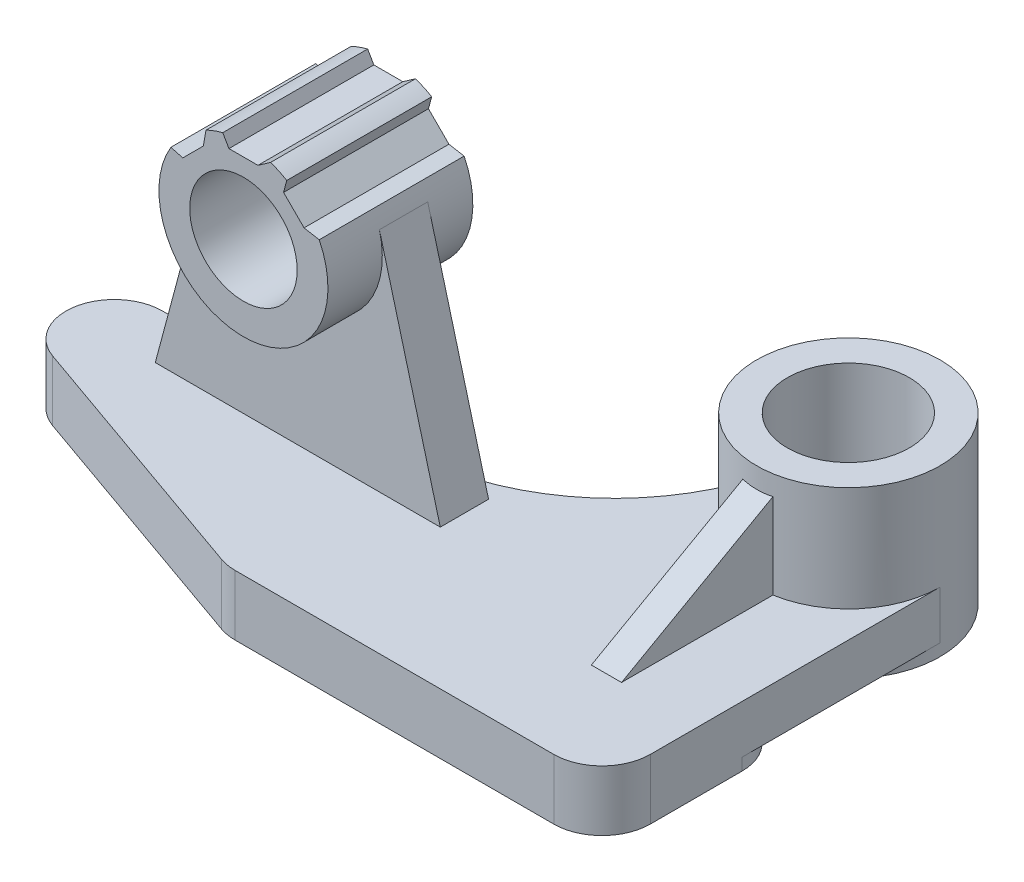
ISO-10303-21;
HEADER;
FILE_DESCRIPTION(('STEP AP214'),'2;1');
FILE_NAME('part.step','',(''),(''),'','','');
FILE_SCHEMA(('AUTOMOTIVE_DESIGN { 1 0 10303 214 1 1 1 1 }'));
ENDSEC;
DATA;
#1=APPLICATION_CONTEXT('core data for automotive mechanical design processes');
#2=APPLICATION_PROTOCOL_DEFINITION('international standard','automotive_design',2000,#1);
#3=PRODUCT_CONTEXT('',#1,'mechanical');
#4=PRODUCT('Part','Part','',(#3));
#5=PRODUCT_RELATED_PRODUCT_CATEGORY('part','',(#4));
#6=PRODUCT_DEFINITION_FORMATION('','',#4);
#7=PRODUCT_DEFINITION_CONTEXT('part definition',#1,'design');
#8=PRODUCT_DEFINITION('design','',#6,#7);
#9=PRODUCT_DEFINITION_SHAPE('','',#8);
#10=(LENGTH_UNIT() NAMED_UNIT(*) SI_UNIT(.MILLI.,.METRE.));
#11=(NAMED_UNIT(*) PLANE_ANGLE_UNIT() SI_UNIT($,.RADIAN.));
#12=(NAMED_UNIT(*) SI_UNIT($,.STERADIAN.) SOLID_ANGLE_UNIT());
#13=UNCERTAINTY_MEASURE_WITH_UNIT(LENGTH_MEASURE(1.E-05),#10,'distance_accuracy_value','');
#14=(GEOMETRIC_REPRESENTATION_CONTEXT(3) GLOBAL_UNCERTAINTY_ASSIGNED_CONTEXT((#13)) GLOBAL_UNIT_ASSIGNED_CONTEXT((#10,
#11,#12)) REPRESENTATION_CONTEXT('',''));
#15=CARTESIAN_POINT('',(0.,0.,0.));
#16=DIRECTION('',(0.,0.,1.));
#17=DIRECTION('',(1.,0.,0.));
#18=AXIS2_PLACEMENT_3D('',#15,#16,#17);
#19=CARTESIAN_POINT('',(-146.,105.,82.));
#20=DIRECTION('',(0.,0.,-1.));
#21=DIRECTION('',(-1.,0.,0.));
#22=AXIS2_PLACEMENT_3D('',#19,#20,#21);
#23=CYLINDRICAL_SURFACE('',#22,35.);
#24=CARTESIAN_POINT('',(-146.,105.,44.5));
#25=DIRECTION('',(0.,0.,1.));
#26=DIRECTION('',(1.,0.,0.));
#27=AXIS2_PLACEMENT_3D('',#24,#25,#26);
#28=CIRCLE('',#27,35.);
#29=CARTESIAN_POINT('',(-154.561534380907,138.936707693065,44.5));
#30=VERTEX_POINT('',#29);
#31=CARTESIAN_POINT('',(-161.498532748708,136.381451251292,44.5));
#32=VERTEX_POINT('',#31);
#33=EDGE_CURVE('E349',#30,#32,#28,.T.);
#34=ORIENTED_EDGE('',*,*,#33,.T.);
#35=DIRECTION('',(0.,0.,1.));
#36=VECTOR('',#35,1.);
#37=CARTESIAN_POINT('',(-161.498532748708,136.381451251292,-38.001));
#38=LINE('',#37,#36);
#39=CARTESIAN_POINT('',(-161.498532748708,136.381451251292,104.5));
#40=VERTEX_POINT('',#39);
#41=EDGE_CURVE('E279',#32,#40,#38,.T.);
#42=ORIENTED_EDGE('',*,*,#41,.T.);
#43=CARTESIAN_POINT('',(-146.,105.,104.5));
#44=DIRECTION('',(0.,0.,1.));
#45=DIRECTION('',(1.,0.,0.));
#46=AXIS2_PLACEMENT_3D('',#43,#44,#45);
#47=CIRCLE('',#46,35.);
#48=CARTESIAN_POINT('',(-154.561534380907,138.936707693065,104.5));
#49=VERTEX_POINT('',#48);
#50=EDGE_CURVE('E343',#49,#40,#47,.T.);
#51=ORIENTED_EDGE('',*,*,#50,.F.);
#52=DIRECTION('',(0.,0.,1.));
#53=VECTOR('',#52,1.);
#54=CARTESIAN_POINT('',(-154.561534380907,138.936707693065,-38.001));
#55=LINE('',#54,#53);
#56=EDGE_CURVE('E325',#30,#49,#55,.T.);
#57=ORIENTED_EDGE('',*,*,#56,.F.);
#58=EDGE_LOOP('',(#34,#42,#51,#57));
#59=FACE_BOUND('',#58,.T.);
#60=ADVANCED_FACE('F41',(#59),#23,.T.);
#61=DIRECTION('',(0.,0.,-1.));
#62=VECTOR('',#61,1.);
#63=CARTESIAN_POINT('',(-112.192596079883,114.058666578588,82.));
#64=LINE('',#63,#62);
#65=CARTESIAN_POINT('',(-112.192596079883,114.058666578588,82.));
#66=VERTEX_POINT('',#65);
#67=CARTESIAN_POINT('',(-112.192596079883,114.058666578588,62.));
#68=VERTEX_POINT('',#67);
#69=EDGE_CURVE('E366',#66,#68,#64,.T.);
#70=ORIENTED_EDGE('',*,*,#69,.T.);
#71=CARTESIAN_POINT('',(-146.,105.,62.));
#72=DIRECTION('',(0.,0.,1.));
#73=DIRECTION('',(1.,0.,0.));
#74=AXIS2_PLACEMENT_3D('',#71,#72,#73);
#75=CIRCLE('',#74,35.);
#76=CARTESIAN_POINT('',(-179.807403920117,114.058666578588,62.));
#77=VERTEX_POINT('',#76);
#78=EDGE_CURVE('E346',#68,#77,#75,.F.);
#79=ORIENTED_EDGE('',*,*,#78,.T.);
#80=DIRECTION('',(0.,0.,-1.));
#81=VECTOR('',#80,1.);
#82=CARTESIAN_POINT('',(-179.807403920117,114.058666578588,82.));
#83=LINE('',#82,#81);
#84=CARTESIAN_POINT('',(-179.807403920117,114.058666578588,82.));
#85=VERTEX_POINT('',#84);
#86=EDGE_CURVE('E379',#85,#77,#83,.T.);
#87=ORIENTED_EDGE('',*,*,#86,.F.);
#88=CARTESIAN_POINT('',(-146.,105.,82.));
#89=DIRECTION('',(0.,0.,1.));
#90=DIRECTION('',(1.,0.,0.));
#91=AXIS2_PLACEMENT_3D('',#88,#89,#90);
#92=CIRCLE('',#91,35.);
#93=EDGE_CURVE('E11',#66,#85,#92,.F.);
#94=ORIENTED_EDGE('',*,*,#93,.F.);
#95=EDGE_LOOP('',(#70,#79,#87,#94));
#96=FACE_BOUND('',#95,.T.);
#97=CARTESIAN_POINT('',(-176.050795159013,122.942957122811,104.5));
#98=VERTEX_POINT('',#97);
#99=CARTESIAN_POINT('',(-114.618548748708,120.498532748707,104.5));
#100=VERTEX_POINT('',#99);
#101=EDGE_CURVE('E347',#98,#100,#47,.T.);
#102=ORIENTED_EDGE('',*,*,#101,.F.);
#103=DIRECTION('',(0.,0.,1.));
#104=VECTOR('',#103,1.);
#105=CARTESIAN_POINT('',(-176.050795159013,122.942957122811,-38.001));
#106=LINE('',#105,#104);
#107=CARTESIAN_POINT('',(-176.050795159013,122.942957122811,44.5));
#108=VERTEX_POINT('',#107);
#109=EDGE_CURVE('E278',#108,#98,#106,.T.);
#110=ORIENTED_EDGE('',*,*,#109,.F.);
#111=CARTESIAN_POINT('',(-114.618548748708,120.498532748707,44.5));
#112=VERTEX_POINT('',#111);
#113=EDGE_CURVE('E352',#108,#112,#28,.T.);
#114=ORIENTED_EDGE('',*,*,#113,.T.);
#115=DIRECTION('',(0.,0.,1.));
#116=VECTOR('',#115,1.);
#117=CARTESIAN_POINT('',(-114.618548748708,120.498532748707,-38.001));
#118=LINE('',#117,#116);
#119=EDGE_CURVE('E303',#112,#100,#118,.T.);
#120=ORIENTED_EDGE('',*,*,#119,.T.);
#121=EDGE_LOOP('',(#102,#110,#114,#120));
#122=FACE_BOUND('',#121,.T.);
#123=ADVANCED_FACE('F519',(#96,#122),#23,.T.);
#124=CARTESIAN_POINT('',(0.,0.,0.));
#125=DIRECTION('',(0.,1.,0.));
#126=DIRECTION('',(0.,0.,1.));
#127=AXIS2_PLACEMENT_3D('',#124,#125,#126);
#128=PLANE('',#127);
#129=CARTESIAN_POINT('',(18.,0.,82.));
#130=DIRECTION('',(0.,-1.,0.));
#131=DIRECTION('',(0.,0.,-1.));
#132=AXIS2_PLACEMENT_3D('',#129,#130,#131);
#133=CIRCLE('',#132,20.);
#134=CARTESIAN_POINT('',(17.9999999999999,0.,62.));
#135=VERTEX_POINT('',#134);
#136=CARTESIAN_POINT('',(38.,0.,82.));
#137=VERTEX_POINT('',#136);
#138=EDGE_CURVE('E396',#135,#137,#133,.T.);
#139=ORIENTED_EDGE('',*,*,#138,.F.);
#140=DIRECTION('',(1.,0.,0.));
#141=VECTOR('',#140,1.);
#142=CARTESIAN_POINT('',(-222.,0.,62.));
#143=LINE('',#142,#141);
#144=CARTESIAN_POINT('',(-124.899959967968,0.,62.));
#145=VERTEX_POINT('',#144);
#146=EDGE_CURVE('E419',#145,#135,#143,.T.);
#147=ORIENTED_EDGE('',*,*,#146,.F.);
#148=CARTESIAN_POINT('',(-124.899959967968,0.,-28.));
#149=DIRECTION('',(0.,-1.,0.));
#150=DIRECTION('',(0.,0.,1.));
#151=AXIS2_PLACEMENT_3D('',#148,#149,#150);
#152=CIRCLE('',#151,90.);
#153=CARTESIAN_POINT('',(-37.0796756154905,0.,-8.31250000000001));
#154=VERTEX_POINT('',#153);
#155=EDGE_CURVE('E430',#154,#145,#152,.T.);
#156=ORIENTED_EDGE('',*,*,#155,.F.);
#157=CARTESIAN_POINT('',(0.,0.,0.));
#158=DIRECTION('',(0.,1.,0.));
#159=DIRECTION('',(0.,0.,1.));
#160=AXIS2_PLACEMENT_3D('',#157,#158,#159);
#161=CIRCLE('',#160,38.);
#162=CARTESIAN_POINT('',(38.,0.,0.));
#163=VERTEX_POINT('',#162);
#164=EDGE_CURVE('E392',#154,#163,#161,.T.);
#165=ORIENTED_EDGE('',*,*,#164,.T.);
#166=DIRECTION('',(0.,0.,-1.));
#167=VECTOR('',#166,1.);
#168=CARTESIAN_POINT('',(38.,0.,0.));
#169=LINE('',#168,#167);
#170=EDGE_CURVE('E435',#137,#163,#169,.T.);
#171=ORIENTED_EDGE('',*,*,#170,.F.);
#172=EDGE_LOOP('',(#139,#147,#156,#165,#171));
#173=FACE_BOUND('',#172,.T.);
#174=ADVANCED_FACE('F499',(#173),#128,.F.);
#175=CARTESIAN_POINT('',(0.,20.,0.));
#176=DIRECTION('',(0.,-1.,0.));
#177=DIRECTION('',(0.,0.,-1.));
#178=AXIS2_PLACEMENT_3D('',#175,#176,#177);
#179=CYLINDRICAL_SURFACE('',#178,38.);
#180=CARTESIAN_POINT('',(0.,-5.,0.));
#181=DIRECTION('',(0.,-1.,0.));
#182=DIRECTION('',(0.,0.,-1.));
#183=AXIS2_PLACEMENT_3D('',#180,#181,#182);
#184=CIRCLE('',#183,38.);
#185=CARTESIAN_POINT('',(0.,-5.,-38.));
#186=VERTEX_POINT('',#185);
#187=EDGE_CURVE('E386',#186,#186,#184,.T.);
#188=ORIENTED_EDGE('',*,*,#187,.F.);
#189=EDGE_LOOP('',(#188));
#190=FACE_BOUND('',#189,.T.);
#191=CARTESIAN_POINT('',(0.,63.5,0.));
#192=DIRECTION('',(0.,-1.,0.));
#193=DIRECTION('',(0.,0.,-1.));
#194=AXIS2_PLACEMENT_3D('',#191,#192,#193);
#195=CIRCLE('',#194,38.);
#196=CARTESIAN_POINT('',(0.,63.5,-38.));
#197=VERTEX_POINT('',#196);
#198=EDGE_CURVE('E389',#197,#197,#195,.T.);
#199=ORIENTED_EDGE('',*,*,#198,.T.);
#200=EDGE_LOOP('',(#199));
#201=FACE_BOUND('',#200,.T.);
#202=DIRECTION('',(0.,-1.,0.));
#203=VECTOR('',#202,1.);
#204=CARTESIAN_POINT('',(38.,20.,0.));
#205=LINE('',#204,#203);
#206=CARTESIAN_POINT('',(38.,20.,0.));
#207=VERTEX_POINT('',#206);
#208=EDGE_CURVE('E450',#207,#163,#205,.T.);
#209=ORIENTED_EDGE('',*,*,#208,.T.);
#210=ORIENTED_EDGE('',*,*,#164,.F.);
#211=DIRECTION('',(0.,-1.,0.));
#212=VECTOR('',#211,1.);
#213=CARTESIAN_POINT('',(-37.0796756154905,20.,-8.3125));
#214=LINE('',#213,#212);
#215=CARTESIAN_POINT('',(-37.0796756154905,20.,-8.3125));
#216=VERTEX_POINT('',#215);
#217=EDGE_CURVE('E422',#216,#154,#214,.T.);
#218=ORIENTED_EDGE('',*,*,#217,.F.);
#219=CARTESIAN_POINT('',(0.,20.,0.));
#220=DIRECTION('',(0.,1.,0.));
#221=DIRECTION('',(0.,0.,1.));
#222=AXIS2_PLACEMENT_3D('',#219,#220,#221);
#223=CIRCLE('',#222,38.);
#224=CARTESIAN_POINT('',(-6.25,20.,37.48249591476));
#225=VERTEX_POINT('',#224);
#226=EDGE_CURVE('E49',#216,#225,#223,.T.);
#227=ORIENTED_EDGE('',*,*,#226,.T.);
#228=DIRECTION('',(0.,-1.,0.));
#229=VECTOR('',#228,1.);
#230=CARTESIAN_POINT('',(-6.25,20.,37.48249591476));
#231=LINE('',#230,#229);
#232=CARTESIAN_POINT('',(-6.25,55.2912853106459,37.48249591476));
#233=VERTEX_POINT('',#232);
#234=EDGE_CURVE('E56',#233,#225,#231,.T.);
#235=ORIENTED_EDGE('',*,*,#234,.F.);
#236=CARTESIAN_POINT('',(0.,76.3888974410871,0.));
#237=DIRECTION('',(0.,0.871439321098038,0.490503322765698));
#238=DIRECTION('',(0.,-0.490503322765698,0.871439321098038));
#239=AXIS2_PLACEMENT_3D('',#236,#237,#238);
#240=ELLIPSE('',#239,43.6060194668734,38.);
#241=CARTESIAN_POINT('',(6.25,55.2912853106459,37.48249591476));
#242=VERTEX_POINT('',#241);
#243=EDGE_CURVE('E239',#233,#242,#240,.T.);
#244=ORIENTED_EDGE('',*,*,#243,.T.);
#245=DIRECTION('',(0.,-1.,0.));
#246=VECTOR('',#245,1.);
#247=CARTESIAN_POINT('',(6.25,20.,37.48249591476));
#248=LINE('',#247,#246);
#249=CARTESIAN_POINT('',(6.25,20.,37.48249591476));
#250=VERTEX_POINT('',#249);
#251=EDGE_CURVE('E258',#242,#250,#248,.T.);
#252=ORIENTED_EDGE('',*,*,#251,.T.);
#253=EDGE_CURVE('E421',#250,#207,#223,.T.);
#254=ORIENTED_EDGE('',*,*,#253,.T.);
#255=EDGE_LOOP('',(#209,#210,#218,#227,#235,#244,#252,#254));
#256=FACE_BOUND('',#255,.T.);
#257=ADVANCED_FACE('F43',(#190,#201,#256),#179,.T.);
#258=CARTESIAN_POINT('',(-124.899959967968,20.,-28.));
#259=DIRECTION('',(0.,-1.,0.));
#260=DIRECTION('',(0.,0.,-1.));
#261=AXIS2_PLACEMENT_3D('',#258,#259,#260);
#262=CYLINDRICAL_SURFACE('',#261,90.);
#263=ORIENTED_EDGE('',*,*,#155,.T.);
#264=DIRECTION('',(0.,-1.,0.));
#265=VECTOR('',#264,1.);
#266=CARTESIAN_POINT('',(-124.899959967968,20.,62.));
#267=LINE('',#266,#265);
#268=CARTESIAN_POINT('',(-124.899959967968,20.,62.));
#269=VERTEX_POINT('',#268);
#270=EDGE_CURVE('E469',#269,#145,#267,.T.);
#271=ORIENTED_EDGE('',*,*,#270,.F.);
#272=CARTESIAN_POINT('',(-124.899959967968,20.,-28.));
#273=DIRECTION('',(0.,-1.,0.));
#274=DIRECTION('',(0.,0.,1.));
#275=AXIS2_PLACEMENT_3D('',#272,#273,#274);
#276=CIRCLE('',#275,90.);
#277=EDGE_CURVE('E431',#216,#269,#276,.T.);
#278=ORIENTED_EDGE('',*,*,#277,.F.);
#279=ORIENTED_EDGE('',*,*,#217,.T.);
#280=EDGE_LOOP('',(#263,#271,#278,#279));
#281=FACE_BOUND('',#280,.T.);
#282=ADVANCED_FACE('F503',(#281),#262,.F.);
#283=CARTESIAN_POINT('',(-222.,20.,62.));
#284=DIRECTION('',(0.,0.,1.));
#285=DIRECTION('',(1.,0.,0.));
#286=AXIS2_PLACEMENT_3D('',#283,#284,#285);
#287=PLANE('',#286);
#288=DIRECTION('',(0.,1.,0.));
#289=VECTOR('',#288,1.);
#290=CARTESIAN_POINT('',(17.9999999999999,-5.,62.));
#291=LINE('',#290,#289);
#292=CARTESIAN_POINT('',(17.9999999999999,-5.,62.));
#293=VERTEX_POINT('',#292);
#294=EDGE_CURVE('E427',#293,#135,#291,.T.);
#295=ORIENTED_EDGE('',*,*,#294,.F.);
#296=DIRECTION('',(1.,0.,0.));
#297=VECTOR('',#296,1.);
#298=CARTESIAN_POINT('',(-222.,-5.,62.));
#299=LINE('',#298,#297);
#300=CARTESIAN_POINT('',(-222.,-5.,62.));
#301=VERTEX_POINT('',#300);
#302=EDGE_CURVE('E411',#301,#293,#299,.T.);
#303=ORIENTED_EDGE('',*,*,#302,.F.);
#304=DIRECTION('',(0.,-1.,0.));
#305=VECTOR('',#304,1.);
#306=CARTESIAN_POINT('',(-222.,20.,62.));
#307=LINE('',#306,#305);
#308=CARTESIAN_POINT('',(-222.,20.,62.));
#309=VERTEX_POINT('',#308);
#310=EDGE_CURVE('E467',#309,#301,#307,.T.);
#311=ORIENTED_EDGE('',*,*,#310,.F.);
#312=DIRECTION('',(-1.,0.,0.));
#313=VECTOR('',#312,1.);
#314=CARTESIAN_POINT('',(-222.,20.,62.));
#315=LINE('',#314,#313);
#316=CARTESIAN_POINT('',(-205.010347670999,20.,62.));
#317=VERTEX_POINT('',#316);
#318=EDGE_CURVE('E434',#317,#309,#315,.T.);
#319=ORIENTED_EDGE('',*,*,#318,.F.);
#320=DIRECTION('',(0.258819045102525,0.965925826289067,0.));
#321=VECTOR('',#320,1.);
#322=CARTESIAN_POINT('',(-206.148438576309,15.7525869177496,62.));
#323=LINE('',#322,#321);
#324=EDGE_CURVE('E355',#317,#77,#323,.T.);
#325=ORIENTED_EDGE('',*,*,#324,.T.);
#326=ORIENTED_EDGE('',*,*,#78,.F.);
#327=DIRECTION('',(0.258819045102525,-0.965925826289067,0.));
#328=VECTOR('',#327,1.);
#329=CARTESIAN_POINT('',(-96.0336307360738,53.7525869177502,62.));
#330=LINE('',#329,#328);
#331=CARTESIAN_POINT('',(-86.9896523290012,20.,62.));
#332=VERTEX_POINT('',#331);
#333=EDGE_CURVE('E360',#68,#332,#330,.T.);
#334=ORIENTED_EDGE('',*,*,#333,.T.);
#335=DIRECTION('',(-1.,0.,0.));
#336=VECTOR('',#335,1.);
#337=CARTESIAN_POINT('',(-222.,20.,62.));
#338=LINE('',#337,#336);
#339=EDGE_CURVE('E368',#332,#269,#338,.T.);
#340=ORIENTED_EDGE('',*,*,#339,.T.);
#341=ORIENTED_EDGE('',*,*,#270,.T.);
#342=ORIENTED_EDGE('',*,*,#146,.T.);
#343=EDGE_LOOP('',(#295,#303,#311,#319,#325,#326,#334,#340,#341,#342));
#344=FACE_BOUND('',#343,.T.);
#345=ADVANCED_FACE('F620',(#344),#287,.F.);
#346=CARTESIAN_POINT('',(-222.,20.,82.));
#347=DIRECTION('',(0.,-1.,0.));
#348=DIRECTION('',(0.,0.,-1.));
#349=AXIS2_PLACEMENT_3D('',#346,#347,#348);
#350=CYLINDRICAL_SURFACE('',#349,20.);
#351=ORIENTED_EDGE('',*,*,#310,.T.);
#352=CARTESIAN_POINT('',(-222.,-5.,82.));
#353=DIRECTION('',(0.,-1.,0.));
#354=DIRECTION('',(0.,0.,-1.));
#355=AXIS2_PLACEMENT_3D('',#352,#353,#354);
#356=CIRCLE('',#355,20.);
#357=CARTESIAN_POINT('',(-228.638124231819,-5.,100.866247816748));
#358=VERTEX_POINT('',#357);
#359=EDGE_CURVE('E408',#358,#301,#356,.T.);
#360=ORIENTED_EDGE('',*,*,#359,.F.);
#361=DIRECTION('',(0.,-1.,0.));
#362=VECTOR('',#361,1.);
#363=CARTESIAN_POINT('',(-228.638124231819,20.,100.866247816748));
#364=LINE('',#363,#362);
#365=CARTESIAN_POINT('',(-228.638124231819,20.,100.866247816748));
#366=VERTEX_POINT('',#365);
#367=EDGE_CURVE('E465',#366,#358,#364,.T.);
#368=ORIENTED_EDGE('',*,*,#367,.F.);
#369=CARTESIAN_POINT('',(-222.,20.,82.));
#370=DIRECTION('',(0.,1.,0.));
#371=DIRECTION('',(0.,0.,-1.));
#372=AXIS2_PLACEMENT_3D('',#369,#370,#371);
#373=CIRCLE('',#372,20.);
#374=EDGE_CURVE('E437',#309,#366,#373,.T.);
#375=ORIENTED_EDGE('',*,*,#374,.F.);
#376=EDGE_LOOP('',(#351,#360,#368,#375));
#377=FACE_BOUND('',#376,.T.);
#378=ADVANCED_FACE('F629',(#377),#350,.T.);
#379=CARTESIAN_POINT('',(-120.638124231819,20.,138.866247816748));
#380=DIRECTION('',(0.331906211590934,0.,-0.943312390837391));
#381=DIRECTION('',(-0.943312390837391,0.,-0.331906211590934));
#382=AXIS2_PLACEMENT_3D('',#379,#380,#381);
#383=PLANE('',#382);
#384=ORIENTED_EDGE('',*,*,#367,.T.);
#385=DIRECTION('',(-0.943312390837391,0.,-0.331906211590934));
#386=VECTOR('',#385,1.);
#387=CARTESIAN_POINT('',(-120.638124231819,-5.,138.866247816748));
#388=LINE('',#387,#386);
#389=CARTESIAN_POINT('',(-120.638124231819,-5.,138.866247816748));
#390=VERTEX_POINT('',#389);
#391=EDGE_CURVE('E405',#390,#358,#388,.T.);
#392=ORIENTED_EDGE('',*,*,#391,.F.);
#393=DIRECTION('',(0.,-1.,0.));
#394=VECTOR('',#393,1.);
#395=CARTESIAN_POINT('',(-120.638124231819,20.,138.866247816748));
#396=LINE('',#395,#394);
#397=CARTESIAN_POINT('',(-120.638124231819,20.,138.866247816748));
#398=VERTEX_POINT('',#397);
#399=EDGE_CURVE('E463',#398,#390,#396,.T.);
#400=ORIENTED_EDGE('',*,*,#399,.F.);
#401=DIRECTION('',(0.943312390837391,0.,0.331906211590934));
#402=VECTOR('',#401,1.);
#403=CARTESIAN_POINT('',(-120.638124231819,20.,138.866247816748));
#404=LINE('',#403,#402);
#405=EDGE_CURVE('E439',#366,#398,#404,.T.);
#406=ORIENTED_EDGE('',*,*,#405,.F.);
#407=EDGE_LOOP('',(#384,#392,#400,#406));
#408=FACE_BOUND('',#407,.T.);
#409=ADVANCED_FACE('F636',(#408),#383,.F.);
#410=CARTESIAN_POINT('',(-114.,20.,120.));
#411=DIRECTION('',(0.,-1.,0.));
#412=DIRECTION('',(0.,0.,-1.));
#413=AXIS2_PLACEMENT_3D('',#410,#411,#412);
#414=CYLINDRICAL_SURFACE('',#413,20.);
#415=ORIENTED_EDGE('',*,*,#399,.T.);
#416=CARTESIAN_POINT('',(-114.,-5.,120.));
#417=DIRECTION('',(0.,-1.,0.));
#418=DIRECTION('',(0.,0.,-1.));
#419=AXIS2_PLACEMENT_3D('',#416,#417,#418);
#420=CIRCLE('',#419,20.);
#421=CARTESIAN_POINT('',(-114.,-5.,140.));
#422=VERTEX_POINT('',#421);
#423=EDGE_CURVE('E402',#422,#390,#420,.T.);
#424=ORIENTED_EDGE('',*,*,#423,.F.);
#425=DIRECTION('',(0.,-1.,0.));
#426=VECTOR('',#425,1.);
#427=CARTESIAN_POINT('',(-114.,20.,140.));
#428=LINE('',#427,#426);
#429=CARTESIAN_POINT('',(-114.,20.,140.));
#430=VERTEX_POINT('',#429);
#431=EDGE_CURVE('E460',#430,#422,#428,.T.);
#432=ORIENTED_EDGE('',*,*,#431,.F.);
#433=CARTESIAN_POINT('',(-114.,20.,120.));
#434=DIRECTION('',(0.,1.,0.));
#435=DIRECTION('',(0.,0.,-1.));
#436=AXIS2_PLACEMENT_3D('',#433,#434,#435);
#437=CIRCLE('',#436,20.);
#438=EDGE_CURVE('E441',#398,#430,#437,.T.);
#439=ORIENTED_EDGE('',*,*,#438,.F.);
#440=EDGE_LOOP('',(#415,#424,#432,#439));
#441=FACE_BOUND('',#440,.T.);
#442=ADVANCED_FACE('F639',(#441),#414,.T.);
#443=CARTESIAN_POINT('',(17.9999999999999,20.,140.));
#444=DIRECTION('',(0.,0.,-1.));
#445=DIRECTION('',(-1.,0.,0.));
#446=AXIS2_PLACEMENT_3D('',#443,#444,#445);
#447=PLANE('',#446);
#448=ORIENTED_EDGE('',*,*,#431,.T.);
#449=DIRECTION('',(-1.,0.,0.));
#450=VECTOR('',#449,1.);
#451=CARTESIAN_POINT('',(17.9999999999999,-5.,140.));
#452=LINE('',#451,#450);
#453=CARTESIAN_POINT('',(17.9999999999999,-5.,140.));
#454=VERTEX_POINT('',#453);
#455=EDGE_CURVE('E400',#454,#422,#452,.T.);
#456=ORIENTED_EDGE('',*,*,#455,.F.);
#457=DIRECTION('',(0.,-1.,0.));
#458=VECTOR('',#457,1.);
#459=CARTESIAN_POINT('',(17.9999999999999,20.,140.));
#460=LINE('',#459,#458);
#461=CARTESIAN_POINT('',(17.9999999999999,20.,140.));
#462=VERTEX_POINT('',#461);
#463=EDGE_CURVE('E458',#462,#454,#460,.T.);
#464=ORIENTED_EDGE('',*,*,#463,.F.);
#465=DIRECTION('',(1.,0.,0.));
#466=VECTOR('',#465,1.);
#467=CARTESIAN_POINT('',(17.9999999999999,20.,140.));
#468=LINE('',#467,#466);
#469=EDGE_CURVE('E443',#430,#462,#468,.T.);
#470=ORIENTED_EDGE('',*,*,#469,.F.);
#471=EDGE_LOOP('',(#448,#456,#464,#470));
#472=FACE_BOUND('',#471,.T.);
#473=ADVANCED_FACE('F642',(#472),#447,.F.);
#474=CARTESIAN_POINT('',(18.,20.,120.));
#475=DIRECTION('',(0.,-1.,0.));
#476=DIRECTION('',(0.,0.,-1.));
#477=AXIS2_PLACEMENT_3D('',#474,#475,#476);
#478=CYLINDRICAL_SURFACE('',#477,20.);
#479=ORIENTED_EDGE('',*,*,#463,.T.);
#480=CARTESIAN_POINT('',(18.,-5.,120.));
#481=DIRECTION('',(0.,-1.,0.));
#482=DIRECTION('',(0.,0.,-1.));
#483=AXIS2_PLACEMENT_3D('',#480,#481,#482);
#484=CIRCLE('',#483,20.);
#485=CARTESIAN_POINT('',(38.,-5.,120.));
#486=VERTEX_POINT('',#485);
#487=EDGE_CURVE('E397',#486,#454,#484,.T.);
#488=ORIENTED_EDGE('',*,*,#487,.F.);
#489=DIRECTION('',(0.,-1.,0.));
#490=VECTOR('',#489,1.);
#491=CARTESIAN_POINT('',(38.,20.,120.));
#492=LINE('',#491,#490);
#493=CARTESIAN_POINT('',(38.,20.,120.));
#494=VERTEX_POINT('',#493);
#495=EDGE_CURVE('E456',#494,#486,#492,.T.);
#496=ORIENTED_EDGE('',*,*,#495,.F.);
#497=CARTESIAN_POINT('',(18.,20.,120.));
#498=DIRECTION('',(0.,1.,0.));
#499=DIRECTION('',(0.,0.,-1.));
#500=AXIS2_PLACEMENT_3D('',#497,#498,#499);
#501=CIRCLE('',#500,20.);
#502=EDGE_CURVE('E445',#462,#494,#501,.T.);
#503=ORIENTED_EDGE('',*,*,#502,.F.);
#504=EDGE_LOOP('',(#479,#488,#496,#503));
#505=FACE_BOUND('',#504,.T.);
#506=ADVANCED_FACE('F487',(#505),#478,.T.);
#507=CARTESIAN_POINT('',(38.,20.,0.));
#508=DIRECTION('',(-1.,0.,0.));
#509=DIRECTION('',(0.,0.,1.));
#510=AXIS2_PLACEMENT_3D('',#507,#508,#509);
#511=PLANE('',#510);
#512=ORIENTED_EDGE('',*,*,#495,.T.);
#513=DIRECTION('',(0.,0.,1.));
#514=VECTOR('',#513,1.);
#515=CARTESIAN_POINT('',(38.,-5.,82.0000000000001));
#516=LINE('',#515,#514);
#517=CARTESIAN_POINT('',(38.,-5.,82.0000000000001));
#518=VERTEX_POINT('',#517);
#519=EDGE_CURVE('E415',#518,#486,#516,.T.);
#520=ORIENTED_EDGE('',*,*,#519,.F.);
#521=DIRECTION('',(0.,1.,0.));
#522=VECTOR('',#521,1.);
#523=CARTESIAN_POINT('',(38.,-5.,82.0000000000001));
#524=LINE('',#523,#522);
#525=EDGE_CURVE('E418',#518,#137,#524,.T.);
#526=ORIENTED_EDGE('',*,*,#525,.T.);
#527=ORIENTED_EDGE('',*,*,#170,.T.);
#528=ORIENTED_EDGE('',*,*,#208,.F.);
#529=DIRECTION('',(0.,0.,-1.));
#530=VECTOR('',#529,1.);
#531=CARTESIAN_POINT('',(38.,20.,0.));
#532=LINE('',#531,#530);
#533=EDGE_CURVE('E447',#494,#207,#532,.T.);
#534=ORIENTED_EDGE('',*,*,#533,.F.);
#535=EDGE_LOOP('',(#512,#520,#526,#527,#528,#534));
#536=FACE_BOUND('',#535,.T.);
#537=ADVANCED_FACE('F479',(#536),#511,.F.);
#538=CARTESIAN_POINT('',(0.,20.,0.));
#539=DIRECTION('',(0.,1.,0.));
#540=DIRECTION('',(0.,0.,1.));
#541=AXIS2_PLACEMENT_3D('',#538,#539,#540);
#542=PLANE('',#541);
#543=DIRECTION('',(0.,0.,-1.));
#544=VECTOR('',#543,1.);
#545=CARTESIAN_POINT('',(6.25,20.,0.));
#546=LINE('',#545,#544);
#547=CARTESIAN_POINT('',(6.25,20.,100.181793318861));
#548=VERTEX_POINT('',#547);
#549=EDGE_CURVE('E256',#548,#250,#546,.T.);
#550=ORIENTED_EDGE('',*,*,#549,.F.);
#551=DIRECTION('',(1.,0.,0.));
#552=VECTOR('',#551,1.);
#553=CARTESIAN_POINT('',(0.,20.,100.181793318861));
#554=LINE('',#553,#552);
#555=CARTESIAN_POINT('',(-6.25,20.,100.181793318861));
#556=VERTEX_POINT('',#555);
#557=EDGE_CURVE('E248',#556,#548,#554,.T.);
#558=ORIENTED_EDGE('',*,*,#557,.F.);
#559=DIRECTION('',(0.,0.,-1.));
#560=VECTOR('',#559,1.);
#561=CARTESIAN_POINT('',(-6.25,20.,0.));
#562=LINE('',#561,#560);
#563=EDGE_CURVE('E251',#556,#225,#562,.T.);
#564=ORIENTED_EDGE('',*,*,#563,.T.);
#565=ORIENTED_EDGE('',*,*,#226,.F.);
#566=ORIENTED_EDGE('',*,*,#277,.T.);
#567=ORIENTED_EDGE('',*,*,#339,.F.);
#568=DIRECTION('',(0.,0.,-1.));
#569=VECTOR('',#568,1.);
#570=CARTESIAN_POINT('',(-86.9896523290012,20.,82.));
#571=LINE('',#570,#569);
#572=CARTESIAN_POINT('',(-86.9896523290012,20.,82.));
#573=VERTEX_POINT('',#572);
#574=EDGE_CURVE('E373',#573,#332,#571,.T.);
#575=ORIENTED_EDGE('',*,*,#574,.F.);
#576=DIRECTION('',(-1.,0.,0.));
#577=VECTOR('',#576,1.);
#578=CARTESIAN_POINT('',(-222.,20.,82.));
#579=LINE('',#578,#577);
#580=CARTESIAN_POINT('',(-205.010347670999,20.,82.));
#581=VERTEX_POINT('',#580);
#582=EDGE_CURVE('E359',#573,#581,#579,.T.);
#583=ORIENTED_EDGE('',*,*,#582,.T.);
#584=DIRECTION('',(0.,0.,-1.));
#585=VECTOR('',#584,1.);
#586=CARTESIAN_POINT('',(-205.010347670999,20.,82.));
#587=LINE('',#586,#585);
#588=EDGE_CURVE('E376',#581,#317,#587,.T.);
#589=ORIENTED_EDGE('',*,*,#588,.T.);
#590=ORIENTED_EDGE('',*,*,#318,.T.);
#591=ORIENTED_EDGE('',*,*,#374,.T.);
#592=ORIENTED_EDGE('',*,*,#405,.T.);
#593=ORIENTED_EDGE('',*,*,#438,.T.);
#594=ORIENTED_EDGE('',*,*,#469,.T.);
#595=ORIENTED_EDGE('',*,*,#502,.T.);
#596=ORIENTED_EDGE('',*,*,#533,.T.);
#597=ORIENTED_EDGE('',*,*,#253,.F.);
#598=EDGE_LOOP('',(#550,#558,#564,#565,#566,#567,#575,#583,#589,#590,#591,#592,#593,#594,#595,
#596,#597));
#599=FACE_BOUND('',#598,.T.);
#600=ADVANCED_FACE('F480',(#599),#542,.T.);
#601=CARTESIAN_POINT('',(18.,-5.,82.));
#602=DIRECTION('',(0.,1.,0.));
#603=DIRECTION('',(0.,0.,1.));
#604=AXIS2_PLACEMENT_3D('',#601,#602,#603);
#605=CYLINDRICAL_SURFACE('',#604,20.);
#606=ORIENTED_EDGE('',*,*,#138,.T.);
#607=ORIENTED_EDGE('',*,*,#525,.F.);
#608=CARTESIAN_POINT('',(18.,-5.,82.));
#609=DIRECTION('',(0.,-1.,0.));
#610=DIRECTION('',(0.,0.,-1.));
#611=AXIS2_PLACEMENT_3D('',#608,#609,#610);
#612=CIRCLE('',#611,20.);
#613=EDGE_CURVE('E413',#293,#518,#612,.T.);
#614=ORIENTED_EDGE('',*,*,#613,.F.);
#615=ORIENTED_EDGE('',*,*,#294,.T.);
#616=EDGE_LOOP('',(#606,#607,#614,#615));
#617=FACE_BOUND('',#616,.T.);
#618=ADVANCED_FACE('F496',(#617),#605,.T.);
#619=CARTESIAN_POINT('',(18.,-5.,120.));
#620=DIRECTION('',(0.,-1.,0.));
#621=DIRECTION('',(0.,0.,-1.));
#622=AXIS2_PLACEMENT_3D('',#619,#620,#621);
#623=PLANE('',#622);
#624=ORIENTED_EDGE('',*,*,#455,.T.);
#625=ORIENTED_EDGE('',*,*,#423,.T.);
#626=ORIENTED_EDGE('',*,*,#391,.T.);
#627=ORIENTED_EDGE('',*,*,#359,.T.);
#628=ORIENTED_EDGE('',*,*,#302,.T.);
#629=ORIENTED_EDGE('',*,*,#613,.T.);
#630=ORIENTED_EDGE('',*,*,#519,.T.);
#631=ORIENTED_EDGE('',*,*,#487,.T.);
#632=EDGE_LOOP('',(#624,#625,#626,#627,#628,#629,#630,#631));
#633=FACE_BOUND('',#632,.T.);
#634=ADVANCED_FACE('F490',(#633),#623,.T.);
#635=CARTESIAN_POINT('',(0.,63.5,0.));
#636=DIRECTION('',(0.,-1.,0.));
#637=DIRECTION('',(0.,0.,-1.));
#638=AXIS2_PLACEMENT_3D('',#635,#636,#637);
#639=PLANE('',#638);
#640=CARTESIAN_POINT('',(0.,63.5,0.));
#641=DIRECTION('',(0.,1.,0.));
#642=DIRECTION('',(0.,0.,1.));
#643=AXIS2_PLACEMENT_3D('',#640,#641,#642);
#644=CIRCLE('',#643,25.25);
#645=CARTESIAN_POINT('',(0.,63.5,25.25));
#646=VERTEX_POINT('',#645);
#647=EDGE_CURVE('E382',#646,#646,#644,.T.);
#648=ORIENTED_EDGE('',*,*,#647,.F.);
#649=EDGE_LOOP('',(#648));
#650=FACE_BOUND('',#649,.T.);
#651=ORIENTED_EDGE('',*,*,#198,.F.);
#652=EDGE_LOOP('',(#651));
#653=FACE_BOUND('',#652,.T.);
#654=ADVANCED_FACE('F673',(#650,#653),#639,.F.);
#655=CARTESIAN_POINT('',(0.,-5.,0.));
#656=DIRECTION('',(0.,-1.,0.));
#657=DIRECTION('',(0.,0.,-1.));
#658=AXIS2_PLACEMENT_3D('',#655,#656,#657);
#659=PLANE('',#658);
#660=CARTESIAN_POINT('',(0.,-5.,0.));
#661=DIRECTION('',(0.,1.,0.));
#662=DIRECTION('',(0.,0.,1.));
#663=AXIS2_PLACEMENT_3D('',#660,#661,#662);
#664=CIRCLE('',#663,25.25);
#665=CARTESIAN_POINT('',(0.,-5.,25.25));
#666=VERTEX_POINT('',#665);
#667=EDGE_CURVE('E383',#666,#666,#664,.T.);
#668=ORIENTED_EDGE('',*,*,#667,.T.);
#669=EDGE_LOOP('',(#668));
#670=FACE_BOUND('',#669,.T.);
#671=ORIENTED_EDGE('',*,*,#187,.T.);
#672=EDGE_LOOP('',(#671));
#673=FACE_BOUND('',#672,.T.);
#674=ADVANCED_FACE('F541',(#670,#673),#659,.T.);
#675=CARTESIAN_POINT('',(0.,-5.,0.));
#676=DIRECTION('',(0.,1.,0.));
#677=DIRECTION('',(0.,0.,1.));
#678=AXIS2_PLACEMENT_3D('',#675,#676,#677);
#679=CYLINDRICAL_SURFACE('',#678,25.25);
#680=ORIENTED_EDGE('',*,*,#667,.F.);
#681=EDGE_LOOP('',(#680));
#682=FACE_BOUND('',#681,.T.);
#683=ORIENTED_EDGE('',*,*,#647,.T.);
#684=EDGE_LOOP('',(#683));
#685=FACE_BOUND('',#684,.T.);
#686=ADVANCED_FACE('F532',(#682,#685),#679,.F.);
#687=CARTESIAN_POINT('',(-128.057042877189,135.050795159013,104.5));
#688=VERTEX_POINT('',#687);
#689=CARTESIAN_POINT('',(-134.769080621789,138.149154588317,104.5));
#690=VERTEX_POINT('',#689);
#691=EDGE_CURVE('E348',#688,#690,#47,.T.);
#692=ORIENTED_EDGE('',*,*,#691,.F.);
#693=DIRECTION('',(0.,0.,1.));
#694=VECTOR('',#693,1.);
#695=CARTESIAN_POINT('',(-128.057042877189,135.050795159013,-38.001));
#696=LINE('',#695,#694);
#697=CARTESIAN_POINT('',(-128.057042877189,135.050795159013,44.5));
#698=VERTEX_POINT('',#697);
#699=EDGE_CURVE('E302',#698,#688,#696,.T.);
#700=ORIENTED_EDGE('',*,*,#699,.F.);
#701=CARTESIAN_POINT('',(-134.769080621789,138.149154588317,44.5));
#702=VERTEX_POINT('',#701);
#703=EDGE_CURVE('E342',#698,#702,#28,.T.);
#704=ORIENTED_EDGE('',*,*,#703,.T.);
#705=DIRECTION('',(0.,0.,1.));
#706=VECTOR('',#705,1.);
#707=CARTESIAN_POINT('',(-134.769080621789,138.149154588317,-38.001));
#708=LINE('',#707,#706);
#709=EDGE_CURVE('E326',#702,#690,#708,.T.);
#710=ORIENTED_EDGE('',*,*,#709,.T.);
#711=EDGE_LOOP('',(#692,#700,#704,#710));
#712=FACE_BOUND('',#711,.T.);
#713=ADVANCED_FACE('F522',(#712),#23,.T.);
#714=CARTESIAN_POINT('',(-206.148438576309,15.7525869177496,82.));
#715=DIRECTION('',(-0.965925826289067,0.258819045102525,0.));
#716=DIRECTION('',(-0.258819045102525,-0.965925826289067,0.));
#717=AXIS2_PLACEMENT_3D('',#714,#715,#716);
#718=PLANE('',#717);
#719=ORIENTED_EDGE('',*,*,#324,.F.);
#720=ORIENTED_EDGE('',*,*,#588,.F.);
#721=DIRECTION('',(0.258819045102525,0.965925826289067,0.));
#722=VECTOR('',#721,1.);
#723=CARTESIAN_POINT('',(-206.148438576309,15.7525869177496,82.));
#724=LINE('',#723,#722);
#725=EDGE_CURVE('E356',#581,#85,#724,.T.);
#726=ORIENTED_EDGE('',*,*,#725,.T.);
#727=ORIENTED_EDGE('',*,*,#86,.T.);
#728=EDGE_LOOP('',(#719,#720,#726,#727));
#729=FACE_BOUND('',#728,.T.);
#730=ADVANCED_FACE('F531',(#729),#718,.T.);
#731=CARTESIAN_POINT('',(-96.0336307360738,53.7525869177502,82.));
#732=DIRECTION('',(0.965925826289067,0.258819045102525,0.));
#733=DIRECTION('',(-0.258819045102525,0.965925826289067,0.));
#734=AXIS2_PLACEMENT_3D('',#731,#732,#733);
#735=PLANE('',#734);
#736=ORIENTED_EDGE('',*,*,#333,.F.);
#737=ORIENTED_EDGE('',*,*,#69,.F.);
#738=DIRECTION('',(0.258819045102525,-0.965925826289067,0.));
#739=VECTOR('',#738,1.);
#740=CARTESIAN_POINT('',(-96.0336307360738,53.7525869177502,82.));
#741=LINE('',#740,#739);
#742=EDGE_CURVE('E363',#66,#573,#741,.T.);
#743=ORIENTED_EDGE('',*,*,#742,.T.);
#744=ORIENTED_EDGE('',*,*,#574,.T.);
#745=EDGE_LOOP('',(#736,#737,#743,#744));
#746=FACE_BOUND('',#745,.T.);
#747=ADVANCED_FACE('F538',(#746),#735,.T.);
#748=CARTESIAN_POINT('',(-146.,105.,82.));
#749=DIRECTION('',(0.,0.,1.));
#750=DIRECTION('',(1.,0.,0.));
#751=AXIS2_PLACEMENT_3D('',#748,#749,#750);
#752=PLANE('',#751);
#753=ORIENTED_EDGE('',*,*,#742,.F.);
#754=ORIENTED_EDGE('',*,*,#93,.T.);
#755=ORIENTED_EDGE('',*,*,#725,.F.);
#756=ORIENTED_EDGE('',*,*,#582,.F.);
#757=EDGE_LOOP('',(#753,#754,#755,#756));
#758=FACE_BOUND('',#757,.T.);
#759=ADVANCED_FACE('F605',(#758),#752,.T.);
#760=CARTESIAN_POINT('',(-146.,105.,104.5));
#761=DIRECTION('',(0.,0.,1.));
#762=DIRECTION('',(1.,0.,0.));
#763=AXIS2_PLACEMENT_3D('',#760,#761,#762);
#764=PLANE('',#763);
#765=DIRECTION('',(0.175364866927772,0.984503511140212,0.));
#766=VECTOR('',#765,1.);
#767=CARTESIAN_POINT('',(-161.498532748708,136.381451251292,104.5));
#768=LINE('',#767,#766);
#769=CARTESIAN_POINT('',(-162.617009357884,130.102290732122,104.5));
#770=VERTEX_POINT('',#769);
#771=EDGE_CURVE('E276',#770,#40,#768,.T.);
#772=ORIENTED_EDGE('',*,*,#771,.F.);
#773=DIRECTION('',(0.707106781186546,0.707106781186549,0.));
#774=VECTOR('',#773,1.);
#775=CARTESIAN_POINT('',(-162.617009357884,130.102290732122,104.5));
#776=LINE('',#775,#774);
#777=CARTESIAN_POINT('',(-171.102290732122,121.617009357884,104.5));
#778=VERTEX_POINT('',#777);
#779=EDGE_CURVE('E273',#778,#770,#776,.T.);
#780=ORIENTED_EDGE('',*,*,#779,.F.);
#781=DIRECTION('',(0.965925826289071,-0.258819045102509,0.));
#782=VECTOR('',#781,1.);
#783=CARTESIAN_POINT('',(-171.102290732122,121.617009357884,104.5));
#784=LINE('',#783,#782);
#785=EDGE_CURVE('E270',#98,#778,#784,.T.);
#786=ORIENTED_EDGE('',*,*,#785,.F.);
#787=ORIENTED_EDGE('',*,*,#101,.T.);
#788=DIRECTION('',(0.984503511140211,-0.175364866927775,0.));
#789=VECTOR('',#788,1.);
#790=CARTESIAN_POINT('',(-114.618548748708,120.498532748707,104.5));
#791=LINE('',#790,#789);
#792=CARTESIAN_POINT('',(-120.897709267878,121.617009357884,104.5));
#793=VERTEX_POINT('',#792);
#794=EDGE_CURVE('E300',#793,#100,#791,.T.);
#795=ORIENTED_EDGE('',*,*,#794,.F.);
#796=DIRECTION('',(0.707106781186546,-0.707106781186549,0.));
#797=VECTOR('',#796,1.);
#798=CARTESIAN_POINT('',(-120.897709267878,121.617009357884,104.5));
#799=LINE('',#798,#797);
#800=CARTESIAN_POINT('',(-129.382990642116,130.102290732122,104.5));
#801=VERTEX_POINT('',#800);
#802=EDGE_CURVE('E297',#801,#793,#799,.T.);
#803=ORIENTED_EDGE('',*,*,#802,.F.);
#804=DIRECTION('',(-0.258819045102513,-0.96592582628907,0.));
#805=VECTOR('',#804,1.);
#806=CARTESIAN_POINT('',(-129.382990642116,130.102290732122,104.5));
#807=LINE('',#806,#805);
#808=EDGE_CURVE('E294',#688,#801,#807,.T.);
#809=ORIENTED_EDGE('',*,*,#808,.F.);
#810=ORIENTED_EDGE('',*,*,#691,.T.);
#811=DIRECTION('',(0.820150795415714,0.572147422242704,0.));
#812=VECTOR('',#811,1.);
#813=CARTESIAN_POINT('',(-134.769080621789,138.149154588317,104.5));
#814=LINE('',#813,#812);
#815=CARTESIAN_POINT('',(-140.,134.5,104.5));
#816=VERTEX_POINT('',#815);
#817=EDGE_CURVE('E322',#816,#690,#814,.T.);
#818=ORIENTED_EDGE('',*,*,#817,.F.);
#819=DIRECTION('',(1.,0.,0.));
#820=VECTOR('',#819,1.);
#821=CARTESIAN_POINT('',(-140.,134.5,104.5));
#822=LINE('',#821,#820);
#823=CARTESIAN_POINT('',(-152.,134.5,104.5));
#824=VERTEX_POINT('',#823);
#825=EDGE_CURVE('E319',#824,#816,#822,.T.);
#826=ORIENTED_EDGE('',*,*,#825,.F.);
#827=DIRECTION('',(0.500000000000009,-0.866025403784433,0.));
#828=VECTOR('',#827,1.);
#829=CARTESIAN_POINT('',(-152.,134.5,104.5));
#830=LINE('',#829,#828);
#831=EDGE_CURVE('E316',#49,#824,#830,.T.);
#832=ORIENTED_EDGE('',*,*,#831,.F.);
#833=ORIENTED_EDGE('',*,*,#50,.T.);
#834=EDGE_LOOP('',(#772,#780,#786,#787,#795,#803,#809,#810,#818,#826,#832,#833));
#835=FACE_BOUND('',#834,.T.);
#836=CARTESIAN_POINT('',(-146.,105.,104.5));
#837=DIRECTION('',(0.,0.,1.));
#838=DIRECTION('',(1.,0.,0.));
#839=AXIS2_PLACEMENT_3D('',#836,#837,#838);
#840=CIRCLE('',#839,22.25);
#841=CARTESIAN_POINT('',(-123.75,105.,104.5));
#842=VERTEX_POINT('',#841);
#843=EDGE_CURVE('E336',#842,#842,#840,.T.);
#844=ORIENTED_EDGE('',*,*,#843,.F.);
#845=EDGE_LOOP('',(#844));
#846=FACE_BOUND('',#845,.T.);
#847=ADVANCED_FACE('F555',(#835,#846),#764,.T.);
#848=CARTESIAN_POINT('',(-146.,105.,44.5));
#849=DIRECTION('',(0.,0.,1.));
#850=DIRECTION('',(1.,0.,0.));
#851=AXIS2_PLACEMENT_3D('',#848,#849,#850);
#852=PLANE('',#851);
#853=CARTESIAN_POINT('',(-146.,105.,44.5));
#854=DIRECTION('',(0.,0.,1.));
#855=DIRECTION('',(1.,0.,0.));
#856=AXIS2_PLACEMENT_3D('',#853,#854,#855);
#857=CIRCLE('',#856,22.25);
#858=CARTESIAN_POINT('',(-123.75,105.,44.5));
#859=VERTEX_POINT('',#858);
#860=EDGE_CURVE('E339',#859,#859,#857,.F.);
#861=ORIENTED_EDGE('',*,*,#860,.F.);
#862=EDGE_LOOP('',(#861));
#863=FACE_BOUND('',#862,.T.);
#864=DIRECTION('',(-0.707106781186546,-0.707106781186549,0.));
#865=VECTOR('',#864,1.);
#866=CARTESIAN_POINT('',(-162.617009357884,130.102290732122,44.5));
#867=LINE('',#866,#865);
#868=CARTESIAN_POINT('',(-162.617009357884,130.102290732122,44.5));
#869=VERTEX_POINT('',#868);
#870=CARTESIAN_POINT('',(-171.102290732122,121.617009357884,44.5));
#871=VERTEX_POINT('',#870);
#872=EDGE_CURVE('E64',#869,#871,#867,.T.);
#873=ORIENTED_EDGE('',*,*,#872,.F.);
#874=DIRECTION('',(-0.175364866927772,-0.984503511140212,0.));
#875=VECTOR('',#874,1.);
#876=CARTESIAN_POINT('',(-161.498532748708,136.381451251292,44.5));
#877=LINE('',#876,#875);
#878=EDGE_CURVE('E266',#32,#869,#877,.T.);
#879=ORIENTED_EDGE('',*,*,#878,.F.);
#880=ORIENTED_EDGE('',*,*,#33,.F.);
#881=DIRECTION('',(-0.500000000000009,0.866025403784433,0.));
#882=VECTOR('',#881,1.);
#883=CARTESIAN_POINT('',(-152.,134.5,44.5));
#884=LINE('',#883,#882);
#885=CARTESIAN_POINT('',(-152.,134.5,44.5));
#886=VERTEX_POINT('',#885);
#887=EDGE_CURVE('E329',#886,#30,#884,.T.);
#888=ORIENTED_EDGE('',*,*,#887,.F.);
#889=DIRECTION('',(-1.,0.,0.));
#890=VECTOR('',#889,1.);
#891=CARTESIAN_POINT('',(-140.,134.5,44.5));
#892=LINE('',#891,#890);
#893=CARTESIAN_POINT('',(-140.,134.5,44.5));
#894=VERTEX_POINT('',#893);
#895=EDGE_CURVE('E289',#894,#886,#892,.T.);
#896=ORIENTED_EDGE('',*,*,#895,.F.);
#897=DIRECTION('',(-0.820150795415714,-0.572147422242704,0.));
#898=VECTOR('',#897,1.);
#899=CARTESIAN_POINT('',(-134.769080621789,138.149154588317,44.5));
#900=LINE('',#899,#898);
#901=EDGE_CURVE('E313',#702,#894,#900,.T.);
#902=ORIENTED_EDGE('',*,*,#901,.F.);
#903=ORIENTED_EDGE('',*,*,#703,.F.);
#904=DIRECTION('',(0.258819045102513,0.965925826289071,0.));
#905=VECTOR('',#904,1.);
#906=CARTESIAN_POINT('',(-129.382990642116,130.102290732122,44.5));
#907=LINE('',#906,#905);
#908=CARTESIAN_POINT('',(-129.382990642116,130.102290732122,44.5));
#909=VERTEX_POINT('',#908);
#910=EDGE_CURVE('E267',#909,#698,#907,.T.);
#911=ORIENTED_EDGE('',*,*,#910,.F.);
#912=DIRECTION('',(-0.707106781186546,0.707106781186549,0.));
#913=VECTOR('',#912,1.);
#914=CARTESIAN_POINT('',(-120.897709267878,121.617009357884,44.5));
#915=LINE('',#914,#913);
#916=CARTESIAN_POINT('',(-120.897709267878,121.617009357884,44.5));
#917=VERTEX_POINT('',#916);
#918=EDGE_CURVE('E247',#917,#909,#915,.T.);
#919=ORIENTED_EDGE('',*,*,#918,.F.);
#920=DIRECTION('',(-0.984503511140211,0.175364866927775,0.));
#921=VECTOR('',#920,1.);
#922=CARTESIAN_POINT('',(-114.618548748708,120.498532748707,44.5));
#923=LINE('',#922,#921);
#924=EDGE_CURVE('E291',#112,#917,#923,.T.);
#925=ORIENTED_EDGE('',*,*,#924,.F.);
#926=ORIENTED_EDGE('',*,*,#113,.F.);
#927=DIRECTION('',(-0.965925826289071,0.258819045102509,0.));
#928=VECTOR('',#927,1.);
#929=CARTESIAN_POINT('',(-171.102290732122,121.617009357884,44.5));
#930=LINE('',#929,#928);
#931=EDGE_CURVE('E282',#871,#108,#930,.T.);
#932=ORIENTED_EDGE('',*,*,#931,.F.);
#933=EDGE_LOOP('',(#873,#879,#880,#888,#896,#902,#903,#911,#919,#925,#926,#932));
#934=FACE_BOUND('',#933,.T.);
#935=ADVANCED_FACE('F568',(#863,#934),#852,.F.);
#936=CARTESIAN_POINT('',(-146.,105.,-38.001));
#937=DIRECTION('',(0.,0.,1.));
#938=DIRECTION('',(1.,0.,0.));
#939=AXIS2_PLACEMENT_3D('',#936,#937,#938);
#940=CYLINDRICAL_SURFACE('',#939,22.25);
#941=ORIENTED_EDGE('',*,*,#843,.T.);
#942=EDGE_LOOP('',(#941));
#943=FACE_BOUND('',#942,.T.);
#944=ORIENTED_EDGE('',*,*,#860,.T.);
#945=EDGE_LOOP('',(#944));
#946=FACE_BOUND('',#945,.T.);
#947=ADVANCED_FACE('F593',(#943,#946),#940,.F.);
#948=CARTESIAN_POINT('',(-134.769080621789,138.149154588317,-38.001));
#949=DIRECTION('',(0.572147422242704,-0.820150795415715,0.));
#950=DIRECTION('',(0.820150795415714,0.572147422242704,0.));
#951=AXIS2_PLACEMENT_3D('',#948,#949,#950);
#952=PLANE('',#951);
#953=ORIENTED_EDGE('',*,*,#901,.T.);
#954=DIRECTION('',(0.,0.,1.));
#955=VECTOR('',#954,1.);
#956=CARTESIAN_POINT('',(-140.,134.5,-38.001));
#957=LINE('',#956,#955);
#958=EDGE_CURVE('E330',#894,#816,#957,.T.);
#959=ORIENTED_EDGE('',*,*,#958,.T.);
#960=ORIENTED_EDGE('',*,*,#817,.T.);
#961=ORIENTED_EDGE('',*,*,#709,.F.);
#962=EDGE_LOOP('',(#953,#959,#960,#961));
#963=FACE_BOUND('',#962,.T.);
#964=ADVANCED_FACE('F589',(#963),#952,.F.);
#965=CARTESIAN_POINT('',(-140.,134.5,-38.001));
#966=DIRECTION('',(0.,-1.,0.));
#967=DIRECTION('',(0.,0.,-1.));
#968=AXIS2_PLACEMENT_3D('',#965,#966,#967);
#969=PLANE('',#968);
#970=ORIENTED_EDGE('',*,*,#895,.T.);
#971=DIRECTION('',(0.,0.,1.));
#972=VECTOR('',#971,1.);
#973=CARTESIAN_POINT('',(-152.,134.5,-38.001));
#974=LINE('',#973,#972);
#975=EDGE_CURVE('E332',#886,#824,#974,.T.);
#976=ORIENTED_EDGE('',*,*,#975,.T.);
#977=ORIENTED_EDGE('',*,*,#825,.T.);
#978=ORIENTED_EDGE('',*,*,#958,.F.);
#979=EDGE_LOOP('',(#970,#976,#977,#978));
#980=FACE_BOUND('',#979,.T.);
#981=ADVANCED_FACE('F592',(#980),#969,.F.);
#982=CARTESIAN_POINT('',(-152.,134.5,-38.001));
#983=DIRECTION('',(-0.866025403784434,-0.500000000000009,0.));
#984=DIRECTION('',(0.500000000000009,-0.866025403784433,0.));
#985=AXIS2_PLACEMENT_3D('',#982,#983,#984);
#986=PLANE('',#985);
#987=ORIENTED_EDGE('',*,*,#887,.T.);
#988=ORIENTED_EDGE('',*,*,#56,.T.);
#989=ORIENTED_EDGE('',*,*,#831,.T.);
#990=ORIENTED_EDGE('',*,*,#975,.F.);
#991=EDGE_LOOP('',(#987,#988,#989,#990));
#992=FACE_BOUND('',#991,.T.);
#993=ADVANCED_FACE('F597',(#992),#986,.F.);
#994=CARTESIAN_POINT('',(-114.618548748708,120.498532748707,-38.001));
#995=DIRECTION('',(-0.175364866927775,-0.984503511140211,0.));
#996=DIRECTION('',(0.984503511140211,-0.175364866927775,0.));
#997=AXIS2_PLACEMENT_3D('',#994,#995,#996);
#998=PLANE('',#997);
#999=ORIENTED_EDGE('',*,*,#924,.T.);
#1000=DIRECTION('',(0.,0.,1.));
#1001=VECTOR('',#1000,1.);
#1002=CARTESIAN_POINT('',(-120.897709267878,121.617009357884,-38.001));
#1003=LINE('',#1002,#1001);
#1004=EDGE_CURVE('E306',#917,#793,#1003,.T.);
#1005=ORIENTED_EDGE('',*,*,#1004,.T.);
#1006=ORIENTED_EDGE('',*,*,#794,.T.);
#1007=ORIENTED_EDGE('',*,*,#119,.F.);
#1008=EDGE_LOOP('',(#999,#1005,#1006,#1007));
#1009=FACE_BOUND('',#1008,.T.);
#1010=ADVANCED_FACE('F565',(#1009),#998,.F.);
#1011=CARTESIAN_POINT('',(-120.897709267878,121.617009357884,-38.001));
#1012=DIRECTION('',(-0.707106781186549,-0.707106781186546,0.));
#1013=DIRECTION('',(0.707106781186546,-0.707106781186549,0.));
#1014=AXIS2_PLACEMENT_3D('',#1011,#1012,#1013);
#1015=PLANE('',#1014);
#1016=ORIENTED_EDGE('',*,*,#918,.T.);
#1017=DIRECTION('',(0.,0.,1.));
#1018=VECTOR('',#1017,1.);
#1019=CARTESIAN_POINT('',(-129.382990642116,130.102290732122,-38.001));
#1020=LINE('',#1019,#1018);
#1021=EDGE_CURVE('E308',#909,#801,#1020,.T.);
#1022=ORIENTED_EDGE('',*,*,#1021,.T.);
#1023=ORIENTED_EDGE('',*,*,#802,.T.);
#1024=ORIENTED_EDGE('',*,*,#1004,.F.);
#1025=EDGE_LOOP('',(#1016,#1022,#1023,#1024));
#1026=FACE_BOUND('',#1025,.T.);
#1027=ADVANCED_FACE('F573',(#1026),#1015,.F.);
#1028=CARTESIAN_POINT('',(-129.382990642116,130.102290732122,-38.001));
#1029=DIRECTION('',(-0.96592582628907,0.258819045102513,0.));
#1030=DIRECTION('',(-0.258819045102513,-0.965925826289071,0.));
#1031=AXIS2_PLACEMENT_3D('',#1028,#1029,#1030);
#1032=PLANE('',#1031);
#1033=ORIENTED_EDGE('',*,*,#910,.T.);
#1034=ORIENTED_EDGE('',*,*,#699,.T.);
#1035=ORIENTED_EDGE('',*,*,#808,.T.);
#1036=ORIENTED_EDGE('',*,*,#1021,.F.);
#1037=EDGE_LOOP('',(#1033,#1034,#1035,#1036));
#1038=FACE_BOUND('',#1037,.T.);
#1039=ADVANCED_FACE('F575',(#1038),#1032,.F.);
#1040=CARTESIAN_POINT('',(-161.498532748708,136.381451251292,-38.001));
#1041=DIRECTION('',(0.984503511140212,-0.175364866927772,0.));
#1042=DIRECTION('',(0.175364866927772,0.984503511140212,0.));
#1043=AXIS2_PLACEMENT_3D('',#1040,#1041,#1042);
#1044=PLANE('',#1043);
#1045=ORIENTED_EDGE('',*,*,#878,.T.);
#1046=DIRECTION('',(0.,0.,1.));
#1047=VECTOR('',#1046,1.);
#1048=CARTESIAN_POINT('',(-162.617009357884,130.102290732122,-38.001));
#1049=LINE('',#1048,#1047);
#1050=EDGE_CURVE('E283',#869,#770,#1049,.T.);
#1051=ORIENTED_EDGE('',*,*,#1050,.T.);
#1052=ORIENTED_EDGE('',*,*,#771,.T.);
#1053=ORIENTED_EDGE('',*,*,#41,.F.);
#1054=EDGE_LOOP('',(#1045,#1051,#1052,#1053));
#1055=FACE_BOUND('',#1054,.T.);
#1056=ADVANCED_FACE('F577',(#1055),#1044,.F.);
#1057=CARTESIAN_POINT('',(-162.617009357884,130.102290732122,-38.001));
#1058=DIRECTION('',(0.707106781186549,-0.707106781186546,0.));
#1059=DIRECTION('',(0.707106781186546,0.707106781186549,0.));
#1060=AXIS2_PLACEMENT_3D('',#1057,#1058,#1059);
#1061=PLANE('',#1060);
#1062=ORIENTED_EDGE('',*,*,#872,.T.);
#1063=DIRECTION('',(0.,0.,1.));
#1064=VECTOR('',#1063,1.);
#1065=CARTESIAN_POINT('',(-171.102290732122,121.617009357884,-38.001));
#1066=LINE('',#1065,#1064);
#1067=EDGE_CURVE('E285',#871,#778,#1066,.T.);
#1068=ORIENTED_EDGE('',*,*,#1067,.T.);
#1069=ORIENTED_EDGE('',*,*,#779,.T.);
#1070=ORIENTED_EDGE('',*,*,#1050,.F.);
#1071=EDGE_LOOP('',(#1062,#1068,#1069,#1070));
#1072=FACE_BOUND('',#1071,.T.);
#1073=ADVANCED_FACE('F583',(#1072),#1061,.F.);
#1074=CARTESIAN_POINT('',(-171.102290732122,121.617009357884,-38.001));
#1075=DIRECTION('',(-0.258819045102509,-0.965925826289071,0.));
#1076=DIRECTION('',(0.965925826289071,-0.258819045102509,0.));
#1077=AXIS2_PLACEMENT_3D('',#1074,#1075,#1076);
#1078=PLANE('',#1077);
#1079=ORIENTED_EDGE('',*,*,#931,.T.);
#1080=ORIENTED_EDGE('',*,*,#109,.T.);
#1081=ORIENTED_EDGE('',*,*,#785,.T.);
#1082=ORIENTED_EDGE('',*,*,#1067,.F.);
#1083=EDGE_LOOP('',(#1079,#1080,#1081,#1082));
#1084=FACE_BOUND('',#1083,.T.);
#1085=ADVANCED_FACE('F516',(#1084),#1078,.F.);
#1086=CARTESIAN_POINT('',(0.,55.,38.));
#1087=DIRECTION('',(0.,0.871439321098038,0.490503322765698));
#1088=DIRECTION('',(0.,-0.490503322765698,0.871439321098038));
#1089=AXIS2_PLACEMENT_3D('',#1086,#1087,#1088);
#1090=PLANE('',#1089);
#1091=ORIENTED_EDGE('',*,*,#243,.F.);
#1092=DIRECTION('',(0.,-0.490503322765698,0.871439321098038));
#1093=VECTOR('',#1092,1.);
#1094=CARTESIAN_POINT('',(-6.25,55.,38.));
#1095=LINE('',#1094,#1093);
#1096=EDGE_CURVE('E241',#233,#556,#1095,.T.);
#1097=ORIENTED_EDGE('',*,*,#1096,.T.);
#1098=ORIENTED_EDGE('',*,*,#557,.T.);
#1099=DIRECTION('',(0.,-0.490503322765698,0.871439321098038));
#1100=VECTOR('',#1099,1.);
#1101=CARTESIAN_POINT('',(6.25,55.,38.));
#1102=LINE('',#1101,#1100);
#1103=EDGE_CURVE('E244',#242,#548,#1102,.T.);
#1104=ORIENTED_EDGE('',*,*,#1103,.F.);
#1105=EDGE_LOOP('',(#1091,#1097,#1098,#1104));
#1106=FACE_BOUND('',#1105,.T.);
#1107=ADVANCED_FACE('F240',(#1106),#1090,.T.);
#1108=CARTESIAN_POINT('',(6.25,66.9683538465326,51.));
#1109=DIRECTION('',(1.,0.,0.));
#1110=DIRECTION('',(0.,0.,-1.));
#1111=AXIS2_PLACEMENT_3D('',#1108,#1109,#1110);
#1112=PLANE('',#1111);
#1113=ORIENTED_EDGE('',*,*,#251,.F.);
#1114=ORIENTED_EDGE('',*,*,#1103,.T.);
#1115=ORIENTED_EDGE('',*,*,#549,.T.);
#1116=EDGE_LOOP('',(#1113,#1114,#1115));
#1117=FACE_BOUND('',#1116,.T.);
#1118=ADVANCED_FACE('F508',(#1117),#1112,.T.);
#1119=CARTESIAN_POINT('',(-6.25,66.9683538465326,51.));
#1120=DIRECTION('',(1.,0.,0.));
#1121=DIRECTION('',(0.,0.,-1.));
#1122=AXIS2_PLACEMENT_3D('',#1119,#1120,#1121);
#1123=PLANE('',#1122);
#1124=ORIENTED_EDGE('',*,*,#1096,.F.);
#1125=ORIENTED_EDGE('',*,*,#234,.T.);
#1126=ORIENTED_EDGE('',*,*,#563,.F.);
#1127=EDGE_LOOP('',(#1124,#1125,#1126));
#1128=FACE_BOUND('',#1127,.T.);
#1129=ADVANCED_FACE('F250',(#1128),#1123,.F.);
#1130=CLOSED_SHELL('',(#60,#123,#174,#257,#282,#345,#378,#409,#442,#473,#506,#537,#600,#618,
#634,#654,#674,#686,#713,#730,#747,#759,#847,#935,#947,#964,#981,#993,#1010,#1027,#1039,#1056,
#1073,#1085,#1107,#1118,#1129));
#1131=MANIFOLD_SOLID_BREP('B2',#1130);
#1132=ADVANCED_BREP_SHAPE_REPRESENTATION('',(#18,#1131),#14);
#1133=SHAPE_DEFINITION_REPRESENTATION(#9,#1132);
ENDSEC;
END-ISO-10303-21;
